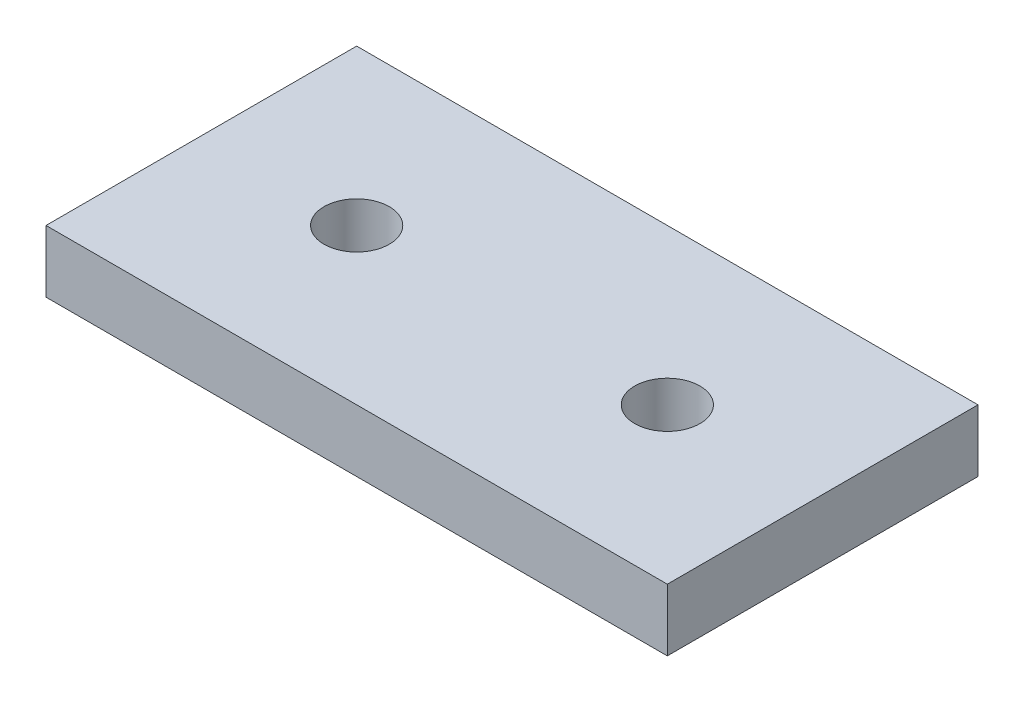
ISO-10303-21;
HEADER;
FILE_DESCRIPTION(('STEP AP214'),'2;1');
FILE_NAME('part.step','',(''),(''),'','','');
FILE_SCHEMA(('AUTOMOTIVE_DESIGN { 1 0 10303 214 1 1 1 1 }'));
ENDSEC;
DATA;
#1=APPLICATION_CONTEXT('core data for automotive mechanical design processes');
#2=APPLICATION_PROTOCOL_DEFINITION('international standard','automotive_design',2000,#1);
#3=PRODUCT_CONTEXT('',#1,'mechanical');
#4=PRODUCT('Part','Part','',(#3));
#5=PRODUCT_RELATED_PRODUCT_CATEGORY('part','',(#4));
#6=PRODUCT_DEFINITION_FORMATION('','',#4);
#7=PRODUCT_DEFINITION_CONTEXT('part definition',#1,'design');
#8=PRODUCT_DEFINITION('design','',#6,#7);
#9=PRODUCT_DEFINITION_SHAPE('','',#8);
#10=(LENGTH_UNIT() NAMED_UNIT(*) SI_UNIT(.MILLI.,.METRE.));
#11=(NAMED_UNIT(*) PLANE_ANGLE_UNIT() SI_UNIT($,.RADIAN.));
#12=(NAMED_UNIT(*) SI_UNIT($,.STERADIAN.) SOLID_ANGLE_UNIT());
#13=UNCERTAINTY_MEASURE_WITH_UNIT(LENGTH_MEASURE(1.E-05),#10,'distance_accuracy_value','');
#14=(GEOMETRIC_REPRESENTATION_CONTEXT(3) GLOBAL_UNCERTAINTY_ASSIGNED_CONTEXT((#13)) GLOBAL_UNIT_ASSIGNED_CONTEXT((#10,
#11,#12)) REPRESENTATION_CONTEXT('',''));
#15=CARTESIAN_POINT('',(0.,0.,0.));
#16=DIRECTION('',(0.,0.,1.));
#17=DIRECTION('',(1.,0.,0.));
#18=AXIS2_PLACEMENT_3D('',#15,#16,#17);
#19=CARTESIAN_POINT('',(0.,4.,0.));
#20=DIRECTION('',(0.,1.,0.));
#21=DIRECTION('',(0.,0.,1.));
#22=AXIS2_PLACEMENT_3D('',#19,#20,#21);
#23=PLANE('',#22);
#24=CARTESIAN_POINT('',(-10.,4.,0.));
#25=DIRECTION('',(0.,1.,0.));
#26=DIRECTION('',(0.,0.,1.));
#27=AXIS2_PLACEMENT_3D('',#24,#25,#26);
#28=CIRCLE('',#27,2.1);
#29=CARTESIAN_POINT('',(-10.,4.,2.1));
#30=VERTEX_POINT('',#29);
#31=EDGE_CURVE('E118',#30,#30,#28,.T.);
#32=ORIENTED_EDGE('',*,*,#31,.F.);
#33=EDGE_LOOP('',(#32));
#34=FACE_BOUND('',#33,.T.);
#35=DIRECTION('',(0.,0.,-1.));
#36=VECTOR('',#35,1.);
#37=CARTESIAN_POINT('',(20.,4.,-10.));
#38=LINE('',#37,#36);
#39=CARTESIAN_POINT('',(20.,4.,10.));
#40=VERTEX_POINT('',#39);
#41=CARTESIAN_POINT('',(20.,4.,-10.));
#42=VERTEX_POINT('',#41);
#43=EDGE_CURVE('E98',#40,#42,#38,.T.);
#44=ORIENTED_EDGE('',*,*,#43,.T.);
#45=DIRECTION('',(-1.,0.,0.));
#46=VECTOR('',#45,1.);
#47=CARTESIAN_POINT('',(-20.,4.,-10.));
#48=LINE('',#47,#46);
#49=CARTESIAN_POINT('',(-20.,4.,-10.));
#50=VERTEX_POINT('',#49);
#51=EDGE_CURVE('E93',#42,#50,#48,.T.);
#52=ORIENTED_EDGE('',*,*,#51,.T.);
#53=DIRECTION('',(0.,0.,1.));
#54=VECTOR('',#53,1.);
#55=CARTESIAN_POINT('',(-20.,4.,-10.));
#56=LINE('',#55,#54);
#57=CARTESIAN_POINT('',(-20.,4.,10.));
#58=VERTEX_POINT('',#57);
#59=EDGE_CURVE('E96',#50,#58,#56,.T.);
#60=ORIENTED_EDGE('',*,*,#59,.T.);
#61=DIRECTION('',(1.,0.,0.));
#62=VECTOR('',#61,1.);
#63=CARTESIAN_POINT('',(-20.,4.,10.));
#64=LINE('',#63,#62);
#65=EDGE_CURVE('E63',#58,#40,#64,.T.);
#66=ORIENTED_EDGE('',*,*,#65,.T.);
#67=EDGE_LOOP('',(#44,#52,#60,#66));
#68=FACE_BOUND('',#67,.T.);
#69=CARTESIAN_POINT('',(9.99999999999999,4.,0.));
#70=DIRECTION('',(0.,1.,0.));
#71=DIRECTION('',(0.,0.,1.));
#72=AXIS2_PLACEMENT_3D('',#69,#70,#71);
#73=CIRCLE('',#72,2.1);
#74=CARTESIAN_POINT('',(9.99999999999999,4.,2.1));
#75=VERTEX_POINT('',#74);
#76=EDGE_CURVE('E140',#75,#75,#73,.T.);
#77=ORIENTED_EDGE('',*,*,#76,.F.);
#78=EDGE_LOOP('',(#77));
#79=FACE_BOUND('',#78,.T.);
#80=ADVANCED_FACE('F45',(#34,#68,#79),#23,.T.);
#81=CARTESIAN_POINT('',(0.,0.,0.));
#82=DIRECTION('',(0.,1.,0.));
#83=DIRECTION('',(0.,0.,1.));
#84=AXIS2_PLACEMENT_3D('',#81,#82,#83);
#85=PLANE('',#84);
#86=DIRECTION('',(0.,0.,-1.));
#87=VECTOR('',#86,1.);
#88=CARTESIAN_POINT('',(20.,0.,-10.));
#89=LINE('',#88,#87);
#90=CARTESIAN_POINT('',(20.,0.,10.));
#91=VERTEX_POINT('',#90);
#92=CARTESIAN_POINT('',(20.,0.,-10.));
#93=VERTEX_POINT('',#92);
#94=EDGE_CURVE('E114',#91,#93,#89,.T.);
#95=ORIENTED_EDGE('',*,*,#94,.F.);
#96=DIRECTION('',(1.,0.,0.));
#97=VECTOR('',#96,1.);
#98=CARTESIAN_POINT('',(-20.,0.,10.));
#99=LINE('',#98,#97);
#100=CARTESIAN_POINT('',(-20.,0.,10.));
#101=VERTEX_POINT('',#100);
#102=EDGE_CURVE('E86',#101,#91,#99,.T.);
#103=ORIENTED_EDGE('',*,*,#102,.F.);
#104=DIRECTION('',(0.,0.,1.));
#105=VECTOR('',#104,1.);
#106=CARTESIAN_POINT('',(-20.,0.,-10.));
#107=LINE('',#106,#105);
#108=CARTESIAN_POINT('',(-20.,0.,-10.));
#109=VERTEX_POINT('',#108);
#110=EDGE_CURVE('E80',#109,#101,#107,.T.);
#111=ORIENTED_EDGE('',*,*,#110,.F.);
#112=DIRECTION('',(-1.,0.,0.));
#113=VECTOR('',#112,1.);
#114=CARTESIAN_POINT('',(-20.,0.,-10.));
#115=LINE('',#114,#113);
#116=EDGE_CURVE('E103',#93,#109,#115,.T.);
#117=ORIENTED_EDGE('',*,*,#116,.F.);
#118=EDGE_LOOP('',(#95,#103,#111,#117));
#119=FACE_BOUND('',#118,.T.);
#120=CARTESIAN_POINT('',(-10.,0.,0.));
#121=DIRECTION('',(0.,1.,0.));
#122=DIRECTION('',(0.,0.,1.));
#123=AXIS2_PLACEMENT_3D('',#120,#121,#122);
#124=CIRCLE('',#123,2.1);
#125=CARTESIAN_POINT('',(-10.,0.,2.1));
#126=VERTEX_POINT('',#125);
#127=EDGE_CURVE('E136',#126,#126,#124,.T.);
#128=ORIENTED_EDGE('',*,*,#127,.T.);
#129=EDGE_LOOP('',(#128));
#130=FACE_BOUND('',#129,.T.);
#131=CARTESIAN_POINT('',(9.99999999999999,0.,0.));
#132=DIRECTION('',(0.,1.,0.));
#133=DIRECTION('',(0.,0.,1.));
#134=AXIS2_PLACEMENT_3D('',#131,#132,#133);
#135=CIRCLE('',#134,2.1);
#136=CARTESIAN_POINT('',(9.99999999999999,0.,2.1));
#137=VERTEX_POINT('',#136);
#138=EDGE_CURVE('E144',#137,#137,#135,.T.);
#139=ORIENTED_EDGE('',*,*,#138,.T.);
#140=EDGE_LOOP('',(#139));
#141=FACE_BOUND('',#140,.T.);
#142=ADVANCED_FACE('F131',(#119,#130,#141),#85,.F.);
#143=CARTESIAN_POINT('',(20.,4.,-10.));
#144=DIRECTION('',(-1.,0.,0.));
#145=DIRECTION('',(0.,0.,1.));
#146=AXIS2_PLACEMENT_3D('',#143,#144,#145);
#147=PLANE('',#146);
#148=ORIENTED_EDGE('',*,*,#94,.T.);
#149=DIRECTION('',(0.,-1.,0.));
#150=VECTOR('',#149,1.);
#151=CARTESIAN_POINT('',(20.,4.,-10.));
#152=LINE('',#151,#150);
#153=EDGE_CURVE('E11',#42,#93,#152,.T.);
#154=ORIENTED_EDGE('',*,*,#153,.F.);
#155=ORIENTED_EDGE('',*,*,#43,.F.);
#156=DIRECTION('',(0.,-1.,0.));
#157=VECTOR('',#156,1.);
#158=CARTESIAN_POINT('',(20.,4.,10.));
#159=LINE('',#158,#157);
#160=EDGE_CURVE('E110',#40,#91,#159,.T.);
#161=ORIENTED_EDGE('',*,*,#160,.T.);
#162=EDGE_LOOP('',(#148,#154,#155,#161));
#163=FACE_BOUND('',#162,.T.);
#164=ADVANCED_FACE('F47',(#163),#147,.F.);
#165=CARTESIAN_POINT('',(-20.,4.,-10.));
#166=DIRECTION('',(0.,0.,1.));
#167=DIRECTION('',(1.,0.,0.));
#168=AXIS2_PLACEMENT_3D('',#165,#166,#167);
#169=PLANE('',#168);
#170=ORIENTED_EDGE('',*,*,#116,.T.);
#171=DIRECTION('',(0.,-1.,0.));
#172=VECTOR('',#171,1.);
#173=CARTESIAN_POINT('',(-20.,4.,-10.));
#174=LINE('',#173,#172);
#175=EDGE_CURVE('E55',#50,#109,#174,.T.);
#176=ORIENTED_EDGE('',*,*,#175,.F.);
#177=ORIENTED_EDGE('',*,*,#51,.F.);
#178=ORIENTED_EDGE('',*,*,#153,.T.);
#179=EDGE_LOOP('',(#170,#176,#177,#178));
#180=FACE_BOUND('',#179,.T.);
#181=ADVANCED_FACE('F102',(#180),#169,.F.);
#182=CARTESIAN_POINT('',(-20.,4.,-10.));
#183=DIRECTION('',(1.,0.,0.));
#184=DIRECTION('',(0.,0.,-1.));
#185=AXIS2_PLACEMENT_3D('',#182,#183,#184);
#186=PLANE('',#185);
#187=ORIENTED_EDGE('',*,*,#110,.T.);
#188=DIRECTION('',(0.,-1.,0.));
#189=VECTOR('',#188,1.);
#190=CARTESIAN_POINT('',(-20.,4.,10.));
#191=LINE('',#190,#189);
#192=EDGE_CURVE('E105',#58,#101,#191,.T.);
#193=ORIENTED_EDGE('',*,*,#192,.F.);
#194=ORIENTED_EDGE('',*,*,#59,.F.);
#195=ORIENTED_EDGE('',*,*,#175,.T.);
#196=EDGE_LOOP('',(#187,#193,#194,#195));
#197=FACE_BOUND('',#196,.T.);
#198=ADVANCED_FACE('F106',(#197),#186,.F.);
#199=CARTESIAN_POINT('',(-20.,4.,10.));
#200=DIRECTION('',(0.,0.,-1.));
#201=DIRECTION('',(-1.,0.,0.));
#202=AXIS2_PLACEMENT_3D('',#199,#200,#201);
#203=PLANE('',#202);
#204=ORIENTED_EDGE('',*,*,#102,.T.);
#205=ORIENTED_EDGE('',*,*,#160,.F.);
#206=ORIENTED_EDGE('',*,*,#65,.F.);
#207=ORIENTED_EDGE('',*,*,#192,.T.);
#208=EDGE_LOOP('',(#204,#205,#206,#207));
#209=FACE_BOUND('',#208,.T.);
#210=ADVANCED_FACE('F128',(#209),#203,.F.);
#211=CARTESIAN_POINT('',(-10.,4.,0.));
#212=DIRECTION('',(0.,-1.,0.));
#213=DIRECTION('',(0.,0.,-1.));
#214=AXIS2_PLACEMENT_3D('',#211,#212,#213);
#215=CYLINDRICAL_SURFACE('',#214,2.1);
#216=ORIENTED_EDGE('',*,*,#31,.T.);
#217=EDGE_LOOP('',(#216));
#218=FACE_BOUND('',#217,.T.);
#219=ORIENTED_EDGE('',*,*,#127,.F.);
#220=EDGE_LOOP('',(#219));
#221=FACE_BOUND('',#220,.T.);
#222=ADVANCED_FACE('F163',(#218,#221),#215,.F.);
#223=CARTESIAN_POINT('',(9.99999999999999,4.,0.));
#224=DIRECTION('',(0.,-1.,0.));
#225=DIRECTION('',(0.,0.,-1.));
#226=AXIS2_PLACEMENT_3D('',#223,#224,#225);
#227=CYLINDRICAL_SURFACE('',#226,2.1);
#228=ORIENTED_EDGE('',*,*,#76,.T.);
#229=EDGE_LOOP('',(#228));
#230=FACE_BOUND('',#229,.T.);
#231=ORIENTED_EDGE('',*,*,#138,.F.);
#232=EDGE_LOOP('',(#231));
#233=FACE_BOUND('',#232,.T.);
#234=ADVANCED_FACE('F152',(#230,#233),#227,.F.);
#235=CLOSED_SHELL('',(#80,#142,#164,#181,#198,#210,#222,#234));
#236=MANIFOLD_SOLID_BREP('B2',#235);
#237=ADVANCED_BREP_SHAPE_REPRESENTATION('',(#18,#236),#14);
#238=SHAPE_DEFINITION_REPRESENTATION(#9,#237);
ENDSEC;
END-ISO-10303-21;
